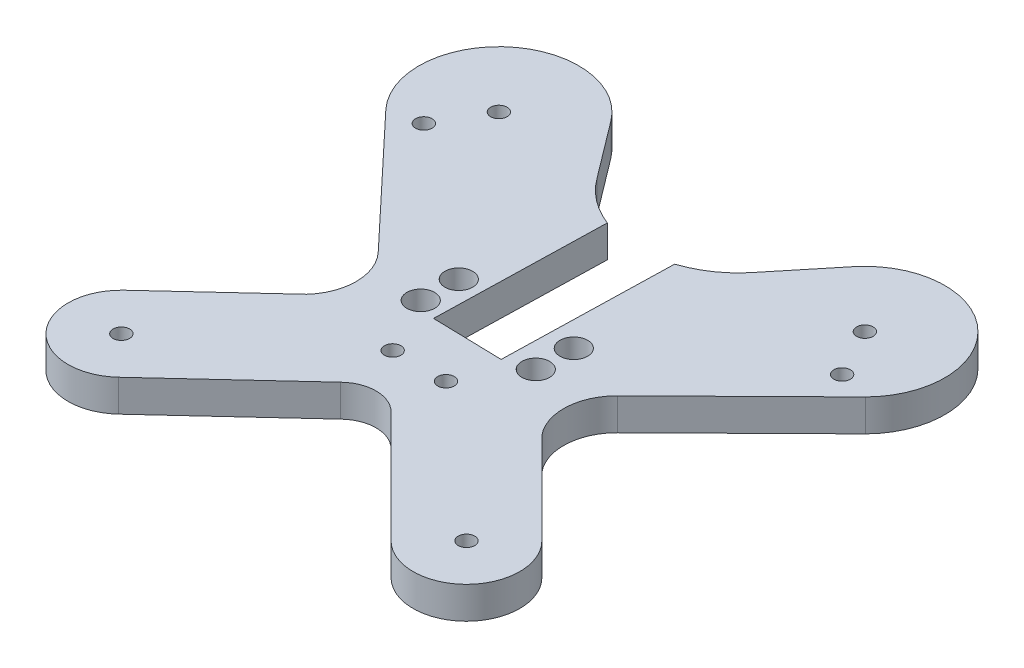
ISO-10303-21;
HEADER;
FILE_DESCRIPTION(('STEP AP214'),'2;1');
FILE_NAME('part.step','',(''),(''),'','','');
FILE_SCHEMA(('AUTOMOTIVE_DESIGN { 1 0 10303 214 1 1 1 1 }'));
ENDSEC;
DATA;
#1=APPLICATION_CONTEXT('core data for automotive mechanical design processes');
#2=APPLICATION_PROTOCOL_DEFINITION('international standard','automotive_design',2000,#1);
#3=PRODUCT_CONTEXT('',#1,'mechanical');
#4=PRODUCT('Part','Part','',(#3));
#5=PRODUCT_RELATED_PRODUCT_CATEGORY('part','',(#4));
#6=PRODUCT_DEFINITION_FORMATION('','',#4);
#7=PRODUCT_DEFINITION_CONTEXT('part definition',#1,'design');
#8=PRODUCT_DEFINITION('design','',#6,#7);
#9=PRODUCT_DEFINITION_SHAPE('','',#8);
#10=(LENGTH_UNIT() NAMED_UNIT(*) SI_UNIT(.MILLI.,.METRE.));
#11=(NAMED_UNIT(*) PLANE_ANGLE_UNIT() SI_UNIT($,.RADIAN.));
#12=(NAMED_UNIT(*) SI_UNIT($,.STERADIAN.) SOLID_ANGLE_UNIT());
#13=UNCERTAINTY_MEASURE_WITH_UNIT(LENGTH_MEASURE(1.E-05),#10,'distance_accuracy_value','');
#14=(GEOMETRIC_REPRESENTATION_CONTEXT(3) GLOBAL_UNCERTAINTY_ASSIGNED_CONTEXT((#13)) GLOBAL_UNIT_ASSIGNED_CONTEXT((#10,
#11,#12)) REPRESENTATION_CONTEXT('',''));
#15=CARTESIAN_POINT('',(0.,0.,0.));
#16=DIRECTION('',(0.,0.,1.));
#17=DIRECTION('',(1.,0.,0.));
#18=AXIS2_PLACEMENT_3D('',#15,#16,#17);
#19=CARTESIAN_POINT('',(145.420498334427,0.,77.6859051133096));
#20=DIRECTION('',(0.,1.,0.));
#21=DIRECTION('',(0.,0.,1.));
#22=AXIS2_PLACEMENT_3D('',#19,#20,#21);
#23=CYLINDRICAL_SURFACE('',#22,15.);
#24=CARTESIAN_POINT('',(145.420498334427,5.99999999999997,77.6859051133096));
#25=DIRECTION('',(0.,1.,0.));
#26=DIRECTION('',(-1.,0.,0.));
#27=AXIS2_PLACEMENT_3D('',#24,#25,#26);
#28=CIRCLE('',#27,15.);
#29=CARTESIAN_POINT('',(156.098066013927,5.99999999999997,88.2210628458594));
#30=VERTEX_POINT('',#29);
#31=CARTESIAN_POINT('',(133.737810721195,5.99999999999997,68.2776741355094));
#32=VERTEX_POINT('',#31);
#33=EDGE_CURVE('E196',#30,#32,#28,.T.);
#34=ORIENTED_EDGE('',*,*,#33,.F.);
#35=DIRECTION('',(0.,1.,0.));
#36=VECTOR('',#35,1.);
#37=CARTESIAN_POINT('',(156.098066013927,0.,88.2210628458594));
#38=LINE('',#37,#36);
#39=CARTESIAN_POINT('',(156.098066013927,0.,88.2210628458594));
#40=VERTEX_POINT('',#39);
#41=EDGE_CURVE('E59',#40,#30,#38,.T.);
#42=ORIENTED_EDGE('',*,*,#41,.F.);
#43=CARTESIAN_POINT('',(145.420498334427,0.,77.6859051133096));
#44=DIRECTION('',(0.,1.,0.));
#45=DIRECTION('',(-1.,0.,0.));
#46=AXIS2_PLACEMENT_3D('',#43,#44,#45);
#47=CIRCLE('',#46,15.);
#48=CARTESIAN_POINT('',(133.737810721195,0.,68.2776741355094));
#49=VERTEX_POINT('',#48);
#50=EDGE_CURVE('E244',#40,#49,#47,.T.);
#51=ORIENTED_EDGE('',*,*,#50,.T.);
#52=DIRECTION('',(0.,1.,0.));
#53=VECTOR('',#52,1.);
#54=CARTESIAN_POINT('',(133.737810721195,0.,68.2776741355094));
#55=LINE('',#54,#53);
#56=EDGE_CURVE('E122',#49,#32,#55,.T.);
#57=ORIENTED_EDGE('',*,*,#56,.T.);
#58=EDGE_LOOP('',(#34,#42,#51,#57));
#59=FACE_BOUND('',#58,.T.);
#60=ADVANCED_FACE('F34',(#59),#23,.T.);
#61=CARTESIAN_POINT('',(156.098066013927,0.,88.2210628458594));
#62=DIRECTION('',(0.701430404943764,0.,0.712737951157666));
#63=DIRECTION('',(0.712737951157666,0.,-0.701430404943764));
#64=AXIS2_PLACEMENT_3D('',#61,#62,#63);
#65=PLANE('',#64);
#66=DIRECTION('',(0.712737951157666,0.,-0.701430404943764));
#67=VECTOR('',#66,1.);
#68=CARTESIAN_POINT('',(156.098066013927,5.99999999999997,88.2210628458594));
#69=LINE('',#68,#67);
#70=CARTESIAN_POINT('',(132.65561135518,5.99999999999997,111.291604322502));
#71=VERTEX_POINT('',#70);
#72=EDGE_CURVE('E241',#71,#30,#69,.T.);
#73=ORIENTED_EDGE('',*,*,#72,.F.);
#74=DIRECTION('',(0.,1.,0.));
#75=VECTOR('',#74,1.);
#76=CARTESIAN_POINT('',(132.65561135518,0.,111.291604322502));
#77=LINE('',#76,#75);
#78=CARTESIAN_POINT('',(132.65561135518,0.,111.291604322502));
#79=VERTEX_POINT('',#78);
#80=EDGE_CURVE('E176',#79,#71,#77,.T.);
#81=ORIENTED_EDGE('',*,*,#80,.F.);
#82=DIRECTION('',(0.712737951157666,0.,-0.701430404943764));
#83=VECTOR('',#82,1.);
#84=CARTESIAN_POINT('',(156.098066013927,0.,88.2210628458594));
#85=LINE('',#84,#83);
#86=EDGE_CURVE('E186',#79,#40,#85,.T.);
#87=ORIENTED_EDGE('',*,*,#86,.T.);
#88=ORIENTED_EDGE('',*,*,#41,.T.);
#89=EDGE_LOOP('',(#73,#81,#87,#88));
#90=FACE_BOUND('',#89,.T.);
#91=ADVANCED_FACE('F470',(#90),#65,.T.);
#92=CARTESIAN_POINT('',(139.669915404618,0.,118.418983834079));
#93=DIRECTION('',(0.,1.,0.));
#94=DIRECTION('',(0.,0.,1.));
#95=AXIS2_PLACEMENT_3D('',#92,#93,#94);
#96=CYLINDRICAL_SURFACE('',#95,10.0000000000005);
#97=CARTESIAN_POINT('',(139.669915404618,5.99999999999997,118.418983834079));
#98=DIRECTION('',(0.,-1.,0.));
#99=DIRECTION('',(-1.,0.,0.));
#100=AXIS2_PLACEMENT_3D('',#97,#98,#99);
#101=CIRCLE('',#100,10.0000000000005);
#102=CARTESIAN_POINT('',(131.98847009833,5.99999999999997,124.82174870611));
#103=VERTEX_POINT('',#102);
#104=EDGE_CURVE('E171',#103,#71,#101,.T.);
#105=ORIENTED_EDGE('',*,*,#104,.F.);
#106=DIRECTION('',(0.,1.,0.));
#107=VECTOR('',#106,1.);
#108=CARTESIAN_POINT('',(131.98847009833,0.,124.82174870611));
#109=LINE('',#108,#107);
#110=CARTESIAN_POINT('',(131.98847009833,0.,124.82174870611));
#111=VERTEX_POINT('',#110);
#112=EDGE_CURVE('E165',#111,#103,#109,.T.);
#113=ORIENTED_EDGE('',*,*,#112,.F.);
#114=CARTESIAN_POINT('',(139.669915404618,0.,118.418983834079));
#115=DIRECTION('',(0.,-1.,0.));
#116=DIRECTION('',(-1.,0.,0.));
#117=AXIS2_PLACEMENT_3D('',#114,#115,#116);
#118=CIRCLE('',#117,10.0000000000005);
#119=EDGE_CURVE('E168',#111,#79,#118,.T.);
#120=ORIENTED_EDGE('',*,*,#119,.T.);
#121=ORIENTED_EDGE('',*,*,#80,.T.);
#122=EDGE_LOOP('',(#105,#113,#120,#121));
#123=FACE_BOUND('',#122,.T.);
#124=ADVANCED_FACE('F167',(#123),#96,.F.);
#125=CARTESIAN_POINT('',(149.107694317768,0.,141.940972925548));
#126=DIRECTION('',(0.707106781186547,0.,-0.707106781186548));
#127=DIRECTION('',(-0.707106781186548,0.,-0.707106781186547));
#128=AXIS2_PLACEMENT_3D('',#125,#126,#127);
#129=PLANE('',#128);
#130=DIRECTION('',(-0.707106781186548,0.,-0.707106781186547));
#131=VECTOR('',#130,1.);
#132=CARTESIAN_POINT('',(149.107694317768,5.99999999999996,141.940972925548));
#133=LINE('',#132,#131);
#134=CARTESIAN_POINT('',(149.107694317768,5.99999999999996,141.940972925548));
#135=VERTEX_POINT('',#134);
#136=EDGE_CURVE('E238',#135,#103,#133,.T.);
#137=ORIENTED_EDGE('',*,*,#136,.F.);
#138=DIRECTION('',(0.,1.,0.));
#139=VECTOR('',#138,1.);
#140=CARTESIAN_POINT('',(149.107694317768,0.,141.940972925548));
#141=LINE('',#140,#139);
#142=CARTESIAN_POINT('',(149.107694317768,0.,141.940972925548));
#143=VERTEX_POINT('',#142);
#144=EDGE_CURVE('E177',#143,#135,#141,.T.);
#145=ORIENTED_EDGE('',*,*,#144,.F.);
#146=DIRECTION('',(-0.707106781186548,0.,-0.707106781186547));
#147=VECTOR('',#146,1.);
#148=CARTESIAN_POINT('',(149.107694317768,0.,141.940972925548));
#149=LINE('',#148,#147);
#150=EDGE_CURVE('E184',#143,#111,#149,.T.);
#151=ORIENTED_EDGE('',*,*,#150,.T.);
#152=ORIENTED_EDGE('',*,*,#112,.T.);
#153=EDGE_LOOP('',(#137,#145,#151,#152));
#154=FACE_BOUND('',#153,.T.);
#155=ADVANCED_FACE('F188',(#154),#129,.T.);
#156=CARTESIAN_POINT('',(142.036626505903,0.,149.012040737414));
#157=DIRECTION('',(0.,1.,0.));
#158=DIRECTION('',(0.,0.,1.));
#159=AXIS2_PLACEMENT_3D('',#156,#157,#158);
#160=CYLINDRICAL_SURFACE('',#159,9.99999999999998);
#161=CARTESIAN_POINT('',(142.036626505903,5.99999999999996,149.012040737414));
#162=DIRECTION('',(0.,1.,0.));
#163=DIRECTION('',(-1.,0.,0.));
#164=AXIS2_PLACEMENT_3D('',#161,#162,#163);
#165=CIRCLE('',#164,9.99999999999998);
#166=CARTESIAN_POINT('',(134.965558694037,5.99999999999996,156.083108549279));
#167=VERTEX_POINT('',#166);
#168=EDGE_CURVE('E235',#167,#135,#165,.T.);
#169=ORIENTED_EDGE('',*,*,#168,.F.);
#170=DIRECTION('',(0.,1.,0.));
#171=VECTOR('',#170,1.);
#172=CARTESIAN_POINT('',(134.965558694037,0.,156.083108549279));
#173=LINE('',#172,#171);
#174=CARTESIAN_POINT('',(134.965558694037,0.,156.083108549279));
#175=VERTEX_POINT('',#174);
#176=EDGE_CURVE('E249',#175,#167,#173,.T.);
#177=ORIENTED_EDGE('',*,*,#176,.F.);
#178=CARTESIAN_POINT('',(142.036626505903,0.,149.012040737414));
#179=DIRECTION('',(0.,1.,0.));
#180=DIRECTION('',(-1.,0.,0.));
#181=AXIS2_PLACEMENT_3D('',#178,#179,#180);
#182=CIRCLE('',#181,9.99999999999998);
#183=EDGE_CURVE('E189',#175,#143,#182,.T.);
#184=ORIENTED_EDGE('',*,*,#183,.T.);
#185=ORIENTED_EDGE('',*,*,#144,.T.);
#186=EDGE_LOOP('',(#169,#177,#184,#185));
#187=FACE_BOUND('',#186,.T.);
#188=ADVANCED_FACE('F483',(#187),#160,.T.);
#189=CARTESIAN_POINT('',(114.107694317768,0.,135.22524417301));
#190=DIRECTION('',(-0.707106781186547,0.,0.707106781186548));
#191=DIRECTION('',(0.707106781186548,0.,0.707106781186547));
#192=AXIS2_PLACEMENT_3D('',#189,#190,#191);
#193=PLANE('',#192);
#194=DIRECTION('',(0.707106781186548,0.,0.707106781186547));
#195=VECTOR('',#194,1.);
#196=CARTESIAN_POINT('',(114.107694317768,5.99999999999997,135.22524417301));
#197=LINE('',#196,#195);
#198=CARTESIAN_POINT('',(114.107694317768,5.99999999999997,135.22524417301));
#199=VERTEX_POINT('',#198);
#200=EDGE_CURVE('E232',#199,#167,#197,.T.);
#201=ORIENTED_EDGE('',*,*,#200,.F.);
#202=DIRECTION('',(0.,1.,0.));
#203=VECTOR('',#202,1.);
#204=CARTESIAN_POINT('',(114.107694317768,0.,135.22524417301));
#205=LINE('',#204,#203);
#206=CARTESIAN_POINT('',(114.107694317768,0.,135.22524417301));
#207=VERTEX_POINT('',#206);
#208=EDGE_CURVE('E251',#207,#199,#205,.T.);
#209=ORIENTED_EDGE('',*,*,#208,.F.);
#210=DIRECTION('',(0.707106781186548,0.,0.707106781186547));
#211=VECTOR('',#210,1.);
#212=CARTESIAN_POINT('',(114.107694317768,0.,135.22524417301));
#213=LINE('',#212,#211);
#214=EDGE_CURVE('E191',#207,#175,#213,.T.);
#215=ORIENTED_EDGE('',*,*,#214,.T.);
#216=ORIENTED_EDGE('',*,*,#176,.T.);
#217=EDGE_LOOP('',(#201,#209,#215,#216));
#218=FACE_BOUND('',#217,.T.);
#219=ADVANCED_FACE('F400',(#218),#193,.T.);
#220=CARTESIAN_POINT('',(109.20638678967,0.,139.940030674159));
#221=DIRECTION('',(0.,1.,0.));
#222=DIRECTION('',(0.,0.,1.));
#223=AXIS2_PLACEMENT_3D('',#220,#221,#222);
#224=CYLINDRICAL_SURFACE('',#223,6.80088429812012);
#225=CARTESIAN_POINT('',(109.20638678967,5.99999999999997,139.940030674159));
#226=DIRECTION('',(0.,-1.,0.));
#227=DIRECTION('',(1.,0.,0.));
#228=AXIS2_PLACEMENT_3D('',#225,#226,#227);
#229=CIRCLE('',#228,6.80088429812012);
#230=CARTESIAN_POINT('',(104.49160028852,5.99999999999997,135.03872314606));
#231=VERTEX_POINT('',#230);
#232=EDGE_CURVE('E229',#231,#199,#229,.T.);
#233=ORIENTED_EDGE('',*,*,#232,.F.);
#234=DIRECTION('',(0.,1.,0.));
#235=VECTOR('',#234,1.);
#236=CARTESIAN_POINT('',(104.49160028852,0.,135.03872314606));
#237=LINE('',#236,#235);
#238=CARTESIAN_POINT('',(104.49160028852,0.,135.03872314606));
#239=VERTEX_POINT('',#238);
#240=EDGE_CURVE('E253',#239,#231,#237,.T.);
#241=ORIENTED_EDGE('',*,*,#240,.F.);
#242=CARTESIAN_POINT('',(109.20638678967,0.,139.940030674159));
#243=DIRECTION('',(0.,-1.,0.));
#244=DIRECTION('',(1.,0.,0.));
#245=AXIS2_PLACEMENT_3D('',#242,#243,#244);
#246=CIRCLE('',#245,6.80088429812012);
#247=EDGE_CURVE('E394',#239,#207,#246,.T.);
#248=ORIENTED_EDGE('',*,*,#247,.T.);
#249=ORIENTED_EDGE('',*,*,#208,.T.);
#250=EDGE_LOOP('',(#233,#241,#248,#249));
#251=FACE_BOUND('',#250,.T.);
#252=ADVANCED_FACE('F406',(#251),#224,.F.);
#253=CARTESIAN_POINT('',(104.49160028852,0.,135.03872314606));
#254=DIRECTION('',(0.679154067520732,0.,0.733995744245186));
#255=DIRECTION('',(0.733995744245187,0.,-0.679154067520732));
#256=AXIS2_PLACEMENT_3D('',#253,#254,#255);
#257=PLANE('',#256);
#258=DIRECTION('',(0.733995744245186,0.,-0.679154067520732));
#259=VECTOR('',#258,1.);
#260=CARTESIAN_POINT('',(104.49160028852,5.99999999999997,135.03872314606));
#261=LINE('',#260,#259);
#262=CARTESIAN_POINT('',(82.8405794051754,5.99999999999997,155.072053058649));
#263=VERTEX_POINT('',#262);
#264=EDGE_CURVE('E226',#263,#231,#261,.T.);
#265=ORIENTED_EDGE('',*,*,#264,.F.);
#266=DIRECTION('',(0.,1.,0.));
#267=VECTOR('',#266,1.);
#268=CARTESIAN_POINT('',(82.8405794051754,0.,155.072053058649));
#269=LINE('',#268,#267);
#270=CARTESIAN_POINT('',(82.8405794051754,0.,155.072053058649));
#271=VERTEX_POINT('',#270);
#272=EDGE_CURVE('E255',#271,#263,#269,.T.);
#273=ORIENTED_EDGE('',*,*,#272,.F.);
#274=DIRECTION('',(0.733995744245186,0.,-0.679154067520732));
#275=VECTOR('',#274,1.);
#276=CARTESIAN_POINT('',(104.49160028852,0.,135.03872314606));
#277=LINE('',#276,#275);
#278=EDGE_CURVE('E391',#271,#239,#277,.T.);
#279=ORIENTED_EDGE('',*,*,#278,.T.);
#280=ORIENTED_EDGE('',*,*,#240,.T.);
#281=EDGE_LOOP('',(#265,#273,#279,#280));
#282=FACE_BOUND('',#281,.T.);
#283=ADVANCED_FACE('F409',(#282),#257,.T.);
#284=CARTESIAN_POINT('',(76.0490387299681,0.,147.732095616197));
#285=DIRECTION('',(0.,1.,0.));
#286=DIRECTION('',(0.,0.,1.));
#287=AXIS2_PLACEMENT_3D('',#284,#285,#286);
#288=CYLINDRICAL_SURFACE('',#287,10.);
#289=CARTESIAN_POINT('',(76.0490387299681,5.99999999999997,147.732095616197));
#290=DIRECTION('',(0.,1.,0.));
#291=DIRECTION('',(1.,0.,0.));
#292=AXIS2_PLACEMENT_3D('',#289,#290,#291);
#293=CIRCLE('',#292,10.);
#294=CARTESIAN_POINT('',(69.2574980547608,5.99999999999997,140.392138173746));
#295=VERTEX_POINT('',#294);
#296=EDGE_CURVE('E223',#295,#263,#293,.T.);
#297=ORIENTED_EDGE('',*,*,#296,.F.);
#298=DIRECTION('',(0.,1.,0.));
#299=VECTOR('',#298,1.);
#300=CARTESIAN_POINT('',(69.2574980547608,0.,140.392138173746));
#301=LINE('',#300,#299);
#302=CARTESIAN_POINT('',(69.2574980547608,0.,140.392138173746));
#303=VERTEX_POINT('',#302);
#304=EDGE_CURVE('E257',#303,#295,#301,.T.);
#305=ORIENTED_EDGE('',*,*,#304,.F.);
#306=CARTESIAN_POINT('',(76.0490387299681,0.,147.732095616197));
#307=DIRECTION('',(0.,1.,0.));
#308=DIRECTION('',(1.,0.,0.));
#309=AXIS2_PLACEMENT_3D('',#306,#307,#308);
#310=CIRCLE('',#309,10.);
#311=EDGE_CURVE('E388',#303,#271,#310,.T.);
#312=ORIENTED_EDGE('',*,*,#311,.T.);
#313=ORIENTED_EDGE('',*,*,#272,.T.);
#314=EDGE_LOOP('',(#297,#305,#312,#313));
#315=FACE_BOUND('',#314,.T.);
#316=ADVANCED_FACE('F414',(#315),#288,.T.);
#317=CARTESIAN_POINT('',(69.2574980547608,0.,140.392138173746));
#318=DIRECTION('',(-0.679154067520732,0.,-0.733995744245187));
#319=DIRECTION('',(-0.733995744245187,0.,0.679154067520732));
#320=AXIS2_PLACEMENT_3D('',#317,#318,#319);
#321=PLANE('',#320);
#322=DIRECTION('',(-0.733995744245187,0.,0.679154067520732));
#323=VECTOR('',#322,1.);
#324=CARTESIAN_POINT('',(69.2574980547608,5.99999999999997,140.392138173746));
#325=LINE('',#324,#323);
#326=CARTESIAN_POINT('',(87.027710498151,5.99999999999997,123.949655834768));
#327=VERTEX_POINT('',#326);
#328=EDGE_CURVE('E220',#327,#295,#325,.T.);
#329=ORIENTED_EDGE('',*,*,#328,.F.);
#330=DIRECTION('',(0.,1.,0.));
#331=VECTOR('',#330,1.);
#332=CARTESIAN_POINT('',(87.027710498151,0.,123.949655834768));
#333=LINE('',#332,#331);
#334=CARTESIAN_POINT('',(87.027710498151,0.,123.949655834768));
#335=VERTEX_POINT('',#334);
#336=EDGE_CURVE('E259',#335,#327,#333,.T.);
#337=ORIENTED_EDGE('',*,*,#336,.F.);
#338=DIRECTION('',(-0.733995744245187,0.,0.679154067520732));
#339=VECTOR('',#338,1.);
#340=CARTESIAN_POINT('',(69.2574980547608,0.,140.392138173746));
#341=LINE('',#340,#339);
#342=EDGE_CURVE('E385',#335,#303,#341,.T.);
#343=ORIENTED_EDGE('',*,*,#342,.T.);
#344=ORIENTED_EDGE('',*,*,#304,.T.);
#345=EDGE_LOOP('',(#329,#337,#343,#344));
#346=FACE_BOUND('',#345,.T.);
#347=ADVANCED_FACE('F417',(#346),#321,.T.);
#348=CARTESIAN_POINT('',(79.6003353782354,0.,117.253828863582));
#349=DIRECTION('',(0.,1.,0.));
#350=DIRECTION('',(0.,0.,1.));
#351=AXIS2_PLACEMENT_3D('',#348,#349,#350);
#352=CYLINDRICAL_SURFACE('',#351,10.0000000000005);
#353=CARTESIAN_POINT('',(79.6003353782354,5.99999999999997,117.253828863582));
#354=DIRECTION('',(0.,-1.,0.));
#355=DIRECTION('',(1.,0.,0.));
#356=AXIS2_PLACEMENT_3D('',#353,#354,#355);
#357=CIRCLE('',#356,10.0000000000005);
#358=CARTESIAN_POINT('',(86.8857554621085,5.99999999999997,110.403817608006));
#359=VERTEX_POINT('',#358);
#360=EDGE_CURVE('E217',#359,#327,#357,.T.);
#361=ORIENTED_EDGE('',*,*,#360,.F.);
#362=DIRECTION('',(0.,1.,0.));
#363=VECTOR('',#362,1.);
#364=CARTESIAN_POINT('',(86.8857554621085,0.,110.403817608006));
#365=LINE('',#364,#363);
#366=CARTESIAN_POINT('',(86.8857554621085,0.,110.403817608006));
#367=VERTEX_POINT('',#366);
#368=EDGE_CURVE('E261',#367,#359,#365,.T.);
#369=ORIENTED_EDGE('',*,*,#368,.F.);
#370=CARTESIAN_POINT('',(79.6003353782354,0.,117.253828863582));
#371=DIRECTION('',(0.,-1.,0.));
#372=DIRECTION('',(1.,0.,0.));
#373=AXIS2_PLACEMENT_3D('',#370,#371,#372);
#374=CIRCLE('',#373,10.0000000000005);
#375=EDGE_CURVE('E382',#367,#335,#374,.T.);
#376=ORIENTED_EDGE('',*,*,#375,.T.);
#377=ORIENTED_EDGE('',*,*,#336,.T.);
#378=EDGE_LOOP('',(#361,#369,#376,#377));
#379=FACE_BOUND('',#378,.T.);
#380=ADVANCED_FACE('F422',(#379),#352,.F.);
#381=CARTESIAN_POINT('',(64.3555845893641,0.,86.4415563437221));
#382=DIRECTION('',(-0.72854200838727,0.,0.685001125557501));
#383=DIRECTION('',(0.685001125557501,0.,0.72854200838727));
#384=AXIS2_PLACEMENT_3D('',#381,#382,#383);
#385=PLANE('',#384);
#386=DIRECTION('',(0.6850011255575,0.,0.72854200838727));
#387=VECTOR('',#386,1.);
#388=CARTESIAN_POINT('',(64.3555845893641,5.99999999999998,86.4415563437221));
#389=LINE('',#388,#387);
#390=CARTESIAN_POINT('',(64.3555845893641,5.99999999999998,86.4415563437221));
#391=VERTEX_POINT('',#390);
#392=EDGE_CURVE('E214',#391,#359,#389,.T.);
#393=ORIENTED_EDGE('',*,*,#392,.F.);
#394=DIRECTION('',(0.,1.,0.));
#395=VECTOR('',#394,1.);
#396=CARTESIAN_POINT('',(64.3555845893641,0.,86.4415563437221));
#397=LINE('',#396,#395);
#398=CARTESIAN_POINT('',(64.3555845893641,0.,86.4415563437221));
#399=VERTEX_POINT('',#398);
#400=EDGE_CURVE('E263',#399,#391,#397,.T.);
#401=ORIENTED_EDGE('',*,*,#400,.F.);
#402=DIRECTION('',(0.6850011255575,0.,0.72854200838727));
#403=VECTOR('',#402,1.);
#404=CARTESIAN_POINT('',(64.3555845893641,0.,86.4415563437221));
#405=LINE('',#404,#403);
#406=EDGE_CURVE('E379',#399,#367,#405,.T.);
#407=ORIENTED_EDGE('',*,*,#406,.T.);
#408=ORIENTED_EDGE('',*,*,#368,.T.);
#409=EDGE_LOOP('',(#393,#401,#407,#408));
#410=FACE_BOUND('',#409,.T.);
#411=ADVANCED_FACE('F425',(#410),#385,.T.);
#412=CARTESIAN_POINT('',(75.4336628144966,0.,76.3283875605046));
#413=DIRECTION('',(0.,1.,0.));
#414=DIRECTION('',(0.,0.,1.));
#415=AXIS2_PLACEMENT_3D('',#412,#413,#414);
#416=CYLINDRICAL_SURFACE('',#415,15.);
#417=CARTESIAN_POINT('',(75.4336628144966,5.99999999999998,76.3283875605046));
#418=DIRECTION('',(0.,1.,0.));
#419=DIRECTION('',(1.,0.,0.));
#420=AXIS2_PLACEMENT_3D('',#417,#418,#419);
#421=CIRCLE('',#420,15.);
#422=CARTESIAN_POINT('',(87.4724039327921,5.99999999999998,67.3802753413457));
#423=VERTEX_POINT('',#422);
#424=EDGE_CURVE('E211',#423,#391,#421,.T.);
#425=ORIENTED_EDGE('',*,*,#424,.F.);
#426=DIRECTION('',(0.,1.,0.));
#427=VECTOR('',#426,1.);
#428=CARTESIAN_POINT('',(87.4724039327921,0.,67.3802753413457));
#429=LINE('',#428,#427);
#430=CARTESIAN_POINT('',(87.4724039327921,0.,67.3802753413457));
#431=VERTEX_POINT('',#430);
#432=EDGE_CURVE('E265',#431,#423,#429,.T.);
#433=ORIENTED_EDGE('',*,*,#432,.F.);
#434=CARTESIAN_POINT('',(75.4336628144966,0.,76.3283875605046));
#435=DIRECTION('',(0.,1.,0.));
#436=DIRECTION('',(1.,0.,0.));
#437=AXIS2_PLACEMENT_3D('',#434,#435,#436);
#438=CIRCLE('',#437,15.);
#439=EDGE_CURVE('E376',#431,#399,#438,.T.);
#440=ORIENTED_EDGE('',*,*,#439,.T.);
#441=ORIENTED_EDGE('',*,*,#400,.T.);
#442=EDGE_LOOP('',(#425,#433,#440,#441));
#443=FACE_BOUND('',#442,.T.);
#444=ADVANCED_FACE('F430',(#443),#416,.T.);
#445=CARTESIAN_POINT('',(95.2822169290583,0.,77.7313532051608));
#446=DIRECTION('',(0.798275218365471,0.,-0.602292848823195));
#447=DIRECTION('',(-0.602292848823195,0.,-0.798275218365471));
#448=AXIS2_PLACEMENT_3D('',#445,#446,#447);
#449=PLANE('',#448);
#450=DIRECTION('',(-0.602292848823195,0.,-0.798275218365471));
#451=VECTOR('',#450,1.);
#452=CARTESIAN_POINT('',(95.2822169290583,5.99999999999998,77.7313532051608));
#453=LINE('',#452,#451);
#454=CARTESIAN_POINT('',(95.2822169290583,5.99999999999998,77.7313532051608));
#455=VERTEX_POINT('',#454);
#456=EDGE_CURVE('E208',#455,#423,#453,.T.);
#457=ORIENTED_EDGE('',*,*,#456,.F.);
#458=DIRECTION('',(0.,1.,0.));
#459=VECTOR('',#458,1.);
#460=CARTESIAN_POINT('',(95.2822169290583,0.,77.7313532051608));
#461=LINE('',#460,#459);
#462=CARTESIAN_POINT('',(95.2822169290583,0.,77.7313532051608));
#463=VERTEX_POINT('',#462);
#464=EDGE_CURVE('E267',#463,#455,#461,.T.);
#465=ORIENTED_EDGE('',*,*,#464,.F.);
#466=DIRECTION('',(-0.602292848823195,0.,-0.798275218365471));
#467=VECTOR('',#466,1.);
#468=CARTESIAN_POINT('',(95.2822169290583,0.,77.7313532051608));
#469=LINE('',#468,#467);
#470=EDGE_CURVE('E373',#463,#431,#469,.T.);
#471=ORIENTED_EDGE('',*,*,#470,.T.);
#472=ORIENTED_EDGE('',*,*,#432,.T.);
#473=EDGE_LOOP('',(#457,#465,#471,#472));
#474=FACE_BOUND('',#473,.T.);
#475=ADVANCED_FACE('F433',(#474),#449,.T.);
#476=CARTESIAN_POINT('',(110.328842906012,0.,66.9046547575992));
#477=DIRECTION('',(0.,1.,0.));
#478=DIRECTION('',(0.,0.,1.));
#479=AXIS2_PLACEMENT_3D('',#476,#477,#478);
#480=CYLINDRICAL_SURFACE('',#479,18.5369456104498);
#481=DIRECTION('',(0.,-1.,0.));
#482=VECTOR('',#481,1.);
#483=CARTESIAN_POINT('',(103.61834975049,9.99999999999998,84.1843432436358));
#484=LINE('',#483,#482);
#485=CARTESIAN_POINT('',(103.61834975049,5.99999999999998,84.1843432436358));
#486=VERTEX_POINT('',#485);
#487=CARTESIAN_POINT('',(103.61834975049,0.,84.1843432436358));
#488=VERTEX_POINT('',#487);
#489=EDGE_CURVE('E50',#486,#488,#484,.T.);
#490=ORIENTED_EDGE('',*,*,#489,.T.);
#491=CARTESIAN_POINT('',(110.328842906012,0.,66.9046547575992));
#492=DIRECTION('',(0.,-1.,0.));
#493=DIRECTION('',(1.,0.,0.));
#494=AXIS2_PLACEMENT_3D('',#491,#492,#493);
#495=CIRCLE('',#494,18.5369456104498);
#496=EDGE_CURVE('E371',#488,#463,#495,.T.);
#497=ORIENTED_EDGE('',*,*,#496,.T.);
#498=ORIENTED_EDGE('',*,*,#464,.T.);
#499=CARTESIAN_POINT('',(110.328842906012,5.99999999999998,66.9046547575992));
#500=DIRECTION('',(0.,-1.,0.));
#501=DIRECTION('',(1.,0.,0.));
#502=AXIS2_PLACEMENT_3D('',#499,#500,#501);
#503=CIRCLE('',#502,18.5369456104498);
#504=EDGE_CURVE('E206',#486,#455,#503,.T.);
#505=ORIENTED_EDGE('',*,*,#504,.F.);
#506=EDGE_LOOP('',(#490,#497,#498,#505));
#507=FACE_BOUND('',#506,.T.);
#508=ADVANCED_FACE('F442',(#507),#480,.F.);
#509=CARTESIAN_POINT('',(110.917008077929,0.,66.916063253767));
#510=DIRECTION('',(0.,1.,0.));
#511=DIRECTION('',(0.,0.,1.));
#512=AXIS2_PLACEMENT_3D('',#509,#510,#511);
#513=CYLINDRICAL_SURFACE('',#512,18.5369456104498);
#514=DIRECTION('',(0.,-1.,0.));
#515=VECTOR('',#514,1.);
#516=CARTESIAN_POINT('',(116.6227068222,9.99999999999998,84.5530515001879));
#517=LINE('',#516,#515);
#518=CARTESIAN_POINT('',(116.6227068222,5.99999999999998,84.5530515001879));
#519=VERTEX_POINT('',#518);
#520=CARTESIAN_POINT('',(116.6227068222,0.,84.5530515001879));
#521=VERTEX_POINT('',#520);
#522=EDGE_CURVE('E309',#519,#521,#517,.T.);
#523=ORIENTED_EDGE('',*,*,#522,.F.);
#524=CARTESIAN_POINT('',(110.917008077929,5.99999999999998,66.916063253767));
#525=DIRECTION('',(0.,-1.,0.));
#526=DIRECTION('',(-1.,0.,0.));
#527=AXIS2_PLACEMENT_3D('',#524,#525,#526);
#528=CIRCLE('',#527,18.5369456104498);
#529=CARTESIAN_POINT('',(125.532468515252,5.99999999999997,78.3181099459099));
#530=VERTEX_POINT('',#529);
#531=EDGE_CURVE('E203',#530,#519,#528,.T.);
#532=ORIENTED_EDGE('',*,*,#531,.F.);
#533=DIRECTION('',(0.,1.,0.));
#534=VECTOR('',#533,1.);
#535=CARTESIAN_POINT('',(125.532468515252,0.,78.3181099459099));
#536=LINE('',#535,#534);
#537=CARTESIAN_POINT('',(125.532468515252,0.,78.3181099459099));
#538=VERTEX_POINT('',#537);
#539=EDGE_CURVE('E270',#538,#530,#536,.T.);
#540=ORIENTED_EDGE('',*,*,#539,.F.);
#541=CARTESIAN_POINT('',(110.917008077929,0.,66.916063253767));
#542=DIRECTION('',(0.,-1.,0.));
#543=DIRECTION('',(-1.,0.,0.));
#544=AXIS2_PLACEMENT_3D('',#541,#542,#543);
#545=CIRCLE('',#544,18.5369456104498);
#546=EDGE_CURVE('E368',#538,#521,#545,.T.);
#547=ORIENTED_EDGE('',*,*,#546,.T.);
#548=EDGE_LOOP('',(#523,#532,#540,#547));
#549=FACE_BOUND('',#548,.T.);
#550=ADVANCED_FACE('F468',(#549),#513,.F.);
#551=CARTESIAN_POINT('',(125.532468515252,0.,78.3181099459099));
#552=DIRECTION('',(-0.77431850039991,0.,-0.632796065046579));
#553=DIRECTION('',(-0.632796065046579,0.,0.77431850039991));
#554=AXIS2_PLACEMENT_3D('',#551,#552,#553);
#555=PLANE('',#554);
#556=DIRECTION('',(-0.632796065046579,0.,0.77431850039991));
#557=VECTOR('',#556,1.);
#558=CARTESIAN_POINT('',(125.532468515252,5.99999999999997,78.3181099459099));
#559=LINE('',#558,#557);
#560=EDGE_CURVE('E199',#32,#530,#559,.T.);
#561=ORIENTED_EDGE('',*,*,#560,.F.);
#562=ORIENTED_EDGE('',*,*,#56,.F.);
#563=DIRECTION('',(-0.632796065046579,0.,0.77431850039991));
#564=VECTOR('',#563,1.);
#565=CARTESIAN_POINT('',(125.532468515252,0.,78.3181099459099));
#566=LINE('',#565,#564);
#567=EDGE_CURVE('E366',#49,#538,#566,.T.);
#568=ORIENTED_EDGE('',*,*,#567,.T.);
#569=ORIENTED_EDGE('',*,*,#539,.T.);
#570=EDGE_LOOP('',(#561,#562,#568,#569));
#571=FACE_BOUND('',#570,.T.);
#572=ADVANCED_FACE('F469',(#571),#555,.T.);
#573=CARTESIAN_POINT('',(145.420498334427,0.,77.6859051133096));
#574=DIRECTION('',(0.,1.,0.));
#575=DIRECTION('',(-1.,0.,0.));
#576=AXIS2_PLACEMENT_3D('',#573,#574,#575);
#577=PLANE('',#576);
#578=CARTESIAN_POINT('',(114.20638678967,0.,125.017952482024));
#579=DIRECTION('',(0.,-1.,0.));
#580=DIRECTION('',(1.,0.,0.));
#581=AXIS2_PLACEMENT_3D('',#578,#579,#580);
#582=CIRCLE('',#581,1.54999999999999);
#583=CARTESIAN_POINT('',(115.75638678967,0.,125.017952482024));
#584=VERTEX_POINT('',#583);
#585=EDGE_CURVE('E298',#584,#584,#582,.T.);
#586=ORIENTED_EDGE('',*,*,#585,.F.);
#587=EDGE_LOOP('',(#586));
#588=FACE_BOUND('',#587,.T.);
#589=CARTESIAN_POINT('',(104.20638678967,0.,125.017952482024));
#590=DIRECTION('',(0.,-1.,0.));
#591=DIRECTION('',(1.,0.,0.));
#592=AXIS2_PLACEMENT_3D('',#589,#590,#591);
#593=CIRCLE('',#592,1.54999999999999);
#594=CARTESIAN_POINT('',(105.75638678967,0.,125.017952482024));
#595=VERTEX_POINT('',#594);
#596=EDGE_CURVE('E287',#595,#595,#593,.T.);
#597=ORIENTED_EDGE('',*,*,#596,.F.);
#598=EDGE_LOOP('',(#597));
#599=FACE_BOUND('',#598,.T.);
#600=CARTESIAN_POINT('',(150.24502004355,0.,86.7811780759343));
#601=DIRECTION('',(0.,-1.,0.));
#602=DIRECTION('',(0.,0.,-1.));
#603=AXIS2_PLACEMENT_3D('',#600,#601,#602);
#604=CIRCLE('',#603,1.55000000069923);
#605=CARTESIAN_POINT('',(150.24502004355,0.,85.2311780752351));
#606=VERTEX_POINT('',#605);
#607=EDGE_CURVE('E281',#606,#606,#604,.T.);
#608=ORIENTED_EDGE('',*,*,#607,.F.);
#609=EDGE_LOOP('',(#608));
#610=FACE_BOUND('',#609,.T.);
#611=CARTESIAN_POINT('',(70.2600651636294,0.,85.2297294441574));
#612=DIRECTION('',(0.,-1.,0.));
#613=DIRECTION('',(0.,0.,-1.));
#614=AXIS2_PLACEMENT_3D('',#611,#612,#613);
#615=CIRCLE('',#614,1.55000000069884);
#616=CARTESIAN_POINT('',(70.2600651636294,0.,83.6797294434586));
#617=VERTEX_POINT('',#616);
#618=EDGE_CURVE('E277',#617,#617,#615,.T.);
#619=ORIENTED_EDGE('',*,*,#618,.F.);
#620=EDGE_LOOP('',(#619));
#621=FACE_BOUND('',#620,.T.);
#622=CARTESIAN_POINT('',(120.698510015395,0.,114.67528334295));
#623=DIRECTION('',(0.,-1.,0.));
#624=DIRECTION('',(1.,0.,0.));
#625=AXIS2_PLACEMENT_3D('',#622,#623,#624);
#626=CIRCLE('',#625,2.60000000017017);
#627=CARTESIAN_POINT('',(123.298510015565,0.,114.67528334295));
#628=VERTEX_POINT('',#627);
#629=EDGE_CURVE('E276',#628,#628,#626,.T.);
#630=ORIENTED_EDGE('',*,*,#629,.F.);
#631=EDGE_LOOP('',(#630));
#632=FACE_BOUND('',#631,.T.);
#633=CARTESIAN_POINT('',(120.834261770675,0.,107.676599790956));
#634=DIRECTION('',(0.,-1.,0.));
#635=DIRECTION('',(1.,0.,0.));
#636=AXIS2_PLACEMENT_3D('',#633,#634,#635);
#637=CIRCLE('',#636,2.60000000017011);
#638=CARTESIAN_POINT('',(123.434261770845,0.,107.676599790956));
#639=VERTEX_POINT('',#638);
#640=EDGE_CURVE('E322',#639,#639,#637,.T.);
#641=ORIENTED_EDGE('',*,*,#640,.F.);
#642=EDGE_LOOP('',(#641));
#643=FACE_BOUND('',#642,.T.);
#644=CARTESIAN_POINT('',(98.7026474233032,0.,114.248634969464));
#645=DIRECTION('',(0.,-1.,0.));
#646=DIRECTION('',(1.,0.,0.));
#647=AXIS2_PLACEMENT_3D('',#644,#645,#646);
#648=CIRCLE('',#647,2.6);
#649=CARTESIAN_POINT('',(101.302647423303,0.,114.248634969464));
#650=VERTEX_POINT('',#649);
#651=EDGE_CURVE('E328',#650,#650,#648,.T.);
#652=ORIENTED_EDGE('',*,*,#651,.F.);
#653=EDGE_LOOP('',(#652));
#654=FACE_BOUND('',#653,.T.);
#655=CARTESIAN_POINT('',(98.8383991786969,0.,107.249951417218));
#656=DIRECTION('',(0.,-1.,0.));
#657=DIRECTION('',(1.,0.,0.));
#658=AXIS2_PLACEMENT_3D('',#655,#656,#657);
#659=CIRCLE('',#658,2.60000000017004);
#660=CARTESIAN_POINT('',(101.438399178867,0.,107.249951417218));
#661=VERTEX_POINT('',#660);
#662=EDGE_CURVE('E334',#661,#661,#659,.T.);
#663=ORIENTED_EDGE('',*,*,#662,.F.);
#664=EDGE_LOOP('',(#663));
#665=FACE_BOUND('',#664,.T.);
#666=CARTESIAN_POINT('',(145.420498334427,0.,77.6859051133096));
#667=DIRECTION('',(0.,1.,0.));
#668=DIRECTION('',(-1.,0.,0.));
#669=AXIS2_PLACEMENT_3D('',#666,#667,#668);
#670=CIRCLE('',#669,1.55000000000002);
#671=CARTESIAN_POINT('',(143.870498334427,0.,77.6859051133096));
#672=VERTEX_POINT('',#671);
#673=EDGE_CURVE('E343',#672,#672,#670,.T.);
#674=ORIENTED_EDGE('',*,*,#673,.T.);
#675=EDGE_LOOP('',(#674));
#676=FACE_BOUND('',#675,.T.);
#677=CARTESIAN_POINT('',(142.036626505903,0.,149.012040737414));
#678=DIRECTION('',(0.,1.,0.));
#679=DIRECTION('',(-1.,0.,0.));
#680=AXIS2_PLACEMENT_3D('',#677,#678,#679);
#681=CIRCLE('',#680,1.54999999999999);
#682=CARTESIAN_POINT('',(140.486626505903,0.,149.012040737414));
#683=VERTEX_POINT('',#682);
#684=EDGE_CURVE('E349',#683,#683,#681,.T.);
#685=ORIENTED_EDGE('',*,*,#684,.T.);
#686=EDGE_LOOP('',(#685));
#687=FACE_BOUND('',#686,.T.);
#688=CARTESIAN_POINT('',(76.0490387299681,0.,147.732095616197));
#689=DIRECTION('',(0.,1.,0.));
#690=DIRECTION('',(1.,0.,0.));
#691=AXIS2_PLACEMENT_3D('',#688,#689,#690);
#692=CIRCLE('',#691,1.55000000000001);
#693=CARTESIAN_POINT('',(77.5990387299682,0.,147.732095616197));
#694=VERTEX_POINT('',#693);
#695=EDGE_CURVE('E355',#694,#694,#692,.T.);
#696=ORIENTED_EDGE('',*,*,#695,.T.);
#697=EDGE_LOOP('',(#696));
#698=FACE_BOUND('',#697,.T.);
#699=CARTESIAN_POINT('',(75.4336628144966,0.,76.3283875605046));
#700=DIRECTION('',(0.,1.,0.));
#701=DIRECTION('',(1.,0.,0.));
#702=AXIS2_PLACEMENT_3D('',#699,#700,#701);
#703=CIRCLE('',#702,1.54999999999999);
#704=CARTESIAN_POINT('',(76.9836628144966,0.,76.3283875605046));
#705=VERTEX_POINT('',#704);
#706=EDGE_CURVE('E200',#705,#705,#703,.T.);
#707=ORIENTED_EDGE('',*,*,#706,.T.);
#708=EDGE_LOOP('',(#707));
#709=FACE_BOUND('',#708,.T.);
#710=DIRECTION('',(-0.999692187914613,0.,-0.0248098654267662));
#711=VECTOR('',#710,1.);
#712=CARTESIAN_POINT('',(115.830023537137,0.,116.30365097818));
#713=LINE('',#712,#711);
#714=CARTESIAN_POINT('',(115.830023537137,0.,116.30365097818));
#715=VERTEX_POINT('',#714);
#716=CARTESIAN_POINT('',(102.834025094247,0.,115.981122727632));
#717=VERTEX_POINT('',#716);
#718=EDGE_CURVE('E286',#715,#717,#713,.T.);
#719=ORIENTED_EDGE('',*,*,#718,.F.);
#720=DIRECTION('',(-0.0249581543237565,0.,0.999688496749238));
#721=VECTOR('',#720,1.);
#722=CARTESIAN_POINT('',(116.6227068222,0.,84.5530515001879));
#723=LINE('',#722,#721);
#724=EDGE_CURVE('E302',#521,#715,#723,.T.);
#725=ORIENTED_EDGE('',*,*,#724,.F.);
#726=ORIENTED_EDGE('',*,*,#546,.F.);
#727=ORIENTED_EDGE('',*,*,#567,.F.);
#728=ORIENTED_EDGE('',*,*,#50,.F.);
#729=ORIENTED_EDGE('',*,*,#86,.F.);
#730=ORIENTED_EDGE('',*,*,#119,.F.);
#731=ORIENTED_EDGE('',*,*,#150,.F.);
#732=ORIENTED_EDGE('',*,*,#183,.F.);
#733=ORIENTED_EDGE('',*,*,#214,.F.);
#734=ORIENTED_EDGE('',*,*,#247,.F.);
#735=ORIENTED_EDGE('',*,*,#278,.F.);
#736=ORIENTED_EDGE('',*,*,#311,.F.);
#737=ORIENTED_EDGE('',*,*,#342,.F.);
#738=ORIENTED_EDGE('',*,*,#375,.F.);
#739=ORIENTED_EDGE('',*,*,#406,.F.);
#740=ORIENTED_EDGE('',*,*,#439,.F.);
#741=ORIENTED_EDGE('',*,*,#470,.F.);
#742=ORIENTED_EDGE('',*,*,#496,.F.);
#743=DIRECTION('',(0.0246592946304064,0.,-0.999695913359823));
#744=VECTOR('',#743,1.);
#745=CARTESIAN_POINT('',(102.834025094247,0.,115.981122727632));
#746=LINE('',#745,#744);
#747=EDGE_CURVE('E291',#717,#488,#746,.T.);
#748=ORIENTED_EDGE('',*,*,#747,.F.);
#749=EDGE_LOOP('',(#719,#725,#726,#727,#728,#729,#730,#731,#732,#733,#734,#735,#736,#737,#738,
#739,#740,#741,#742,#748));
#750=FACE_BOUND('',#749,.T.);
#751=ADVANCED_FACE('F182',(#588,#599,#610,#621,#632,#643,#654,#665,#676,#687,#698,#709,#750),
#577,.F.);
#752=CARTESIAN_POINT('',(145.420498334427,5.99999999999997,77.6859051133096));
#753=DIRECTION('',(0.,1.,0.));
#754=DIRECTION('',(-1.,0.,0.));
#755=AXIS2_PLACEMENT_3D('',#752,#753,#754);
#756=PLANE('',#755);
#757=CARTESIAN_POINT('',(114.20638678967,5.99999999999997,125.017952482024));
#758=DIRECTION('',(0.,1.,0.));
#759=DIRECTION('',(-1.,0.,0.));
#760=AXIS2_PLACEMENT_3D('',#757,#758,#759);
#761=CIRCLE('',#760,1.54999999999999);
#762=CARTESIAN_POINT('',(112.65638678967,5.99999999999997,125.017952482024));
#763=VERTEX_POINT('',#762);
#764=EDGE_CURVE('E37',#763,#763,#761,.T.);
#765=ORIENTED_EDGE('',*,*,#764,.F.);
#766=EDGE_LOOP('',(#765));
#767=FACE_BOUND('',#766,.T.);
#768=CARTESIAN_POINT('',(104.20638678967,5.99999999999997,125.017952482024));
#769=DIRECTION('',(0.,1.,0.));
#770=DIRECTION('',(-1.,0.,0.));
#771=AXIS2_PLACEMENT_3D('',#768,#769,#770);
#772=CIRCLE('',#771,1.54999999999999);
#773=CARTESIAN_POINT('',(102.65638678967,5.99999999999997,125.017952482024));
#774=VERTEX_POINT('',#773);
#775=EDGE_CURVE('E284',#774,#774,#772,.T.);
#776=ORIENTED_EDGE('',*,*,#775,.F.);
#777=EDGE_LOOP('',(#776));
#778=FACE_BOUND('',#777,.T.);
#779=DIRECTION('',(0.0249581543237565,0.,-0.999688496749238));
#780=VECTOR('',#779,1.);
#781=CARTESIAN_POINT('',(116.81198314951,5.99999999999998,76.9716668888221));
#782=LINE('',#781,#780);
#783=CARTESIAN_POINT('',(115.830023537137,5.99999999999997,116.30365097818));
#784=VERTEX_POINT('',#783);
#785=EDGE_CURVE('E11',#784,#519,#782,.T.);
#786=ORIENTED_EDGE('',*,*,#785,.F.);
#787=DIRECTION('',(0.999692187914613,0.,0.0248098654267662));
#788=VECTOR('',#787,1.);
#789=CARTESIAN_POINT('',(144.444478363662,5.99999999999997,117.013790341165));
#790=LINE('',#789,#788);
#791=CARTESIAN_POINT('',(102.834025094247,5.99999999999997,115.981122727632));
#792=VERTEX_POINT('',#791);
#793=EDGE_CURVE('E42',#792,#784,#790,.T.);
#794=ORIENTED_EDGE('',*,*,#793,.F.);
#795=DIRECTION('',(-0.0246592946304064,0.,0.999695913359823));
#796=VECTOR('',#795,1.);
#797=CARTESIAN_POINT('',(103.803967006482,5.99999999999998,76.6593586467322));
#798=LINE('',#797,#796);
#799=EDGE_CURVE('E246',#486,#792,#798,.T.);
#800=ORIENTED_EDGE('',*,*,#799,.F.);
#801=ORIENTED_EDGE('',*,*,#504,.T.);
#802=ORIENTED_EDGE('',*,*,#456,.T.);
#803=ORIENTED_EDGE('',*,*,#424,.T.);
#804=ORIENTED_EDGE('',*,*,#392,.T.);
#805=ORIENTED_EDGE('',*,*,#360,.T.);
#806=ORIENTED_EDGE('',*,*,#328,.T.);
#807=ORIENTED_EDGE('',*,*,#296,.T.);
#808=ORIENTED_EDGE('',*,*,#264,.T.);
#809=ORIENTED_EDGE('',*,*,#232,.T.);
#810=ORIENTED_EDGE('',*,*,#200,.T.);
#811=ORIENTED_EDGE('',*,*,#168,.T.);
#812=ORIENTED_EDGE('',*,*,#136,.T.);
#813=ORIENTED_EDGE('',*,*,#104,.T.);
#814=ORIENTED_EDGE('',*,*,#72,.T.);
#815=ORIENTED_EDGE('',*,*,#33,.T.);
#816=ORIENTED_EDGE('',*,*,#560,.T.);
#817=ORIENTED_EDGE('',*,*,#531,.T.);
#818=EDGE_LOOP('',(#786,#794,#800,#801,#802,#803,#804,#805,#806,#807,#808,#809,#810,#811,#812,
#813,#814,#815,#816,#817));
#819=FACE_BOUND('',#818,.T.);
#820=CARTESIAN_POINT('',(150.24502004355,5.99999999999997,86.7811780759343));
#821=DIRECTION('',(0.,1.,0.));
#822=DIRECTION('',(-1.,0.,0.));
#823=AXIS2_PLACEMENT_3D('',#820,#821,#822);
#824=CIRCLE('',#823,1.55000000069923);
#825=CARTESIAN_POINT('',(148.695020042851,5.99999999999997,86.7811780759343));
#826=VERTEX_POINT('',#825);
#827=EDGE_CURVE('E278',#826,#826,#824,.T.);
#828=ORIENTED_EDGE('',*,*,#827,.F.);
#829=EDGE_LOOP('',(#828));
#830=FACE_BOUND('',#829,.T.);
#831=CARTESIAN_POINT('',(70.2600651636294,5.99999999999998,85.2297294441574));
#832=DIRECTION('',(0.,1.,0.));
#833=DIRECTION('',(-1.,0.,0.));
#834=AXIS2_PLACEMENT_3D('',#831,#832,#833);
#835=CIRCLE('',#834,1.55000000069884);
#836=CARTESIAN_POINT('',(68.7100651629306,5.99999999999998,85.2297294441574));
#837=VERTEX_POINT('',#836);
#838=EDGE_CURVE('E273',#837,#837,#835,.T.);
#839=ORIENTED_EDGE('',*,*,#838,.F.);
#840=EDGE_LOOP('',(#839));
#841=FACE_BOUND('',#840,.T.);
#842=CARTESIAN_POINT('',(120.698510015395,5.99999999999999,114.67528334295));
#843=DIRECTION('',(0.,-1.,0.));
#844=DIRECTION('',(1.,0.,0.));
#845=AXIS2_PLACEMENT_3D('',#842,#843,#844);
#846=CIRCLE('',#845,2.60000000017017);
#847=CARTESIAN_POINT('',(123.298510015565,5.99999999999999,114.67528334295));
#848=VERTEX_POINT('',#847);
#849=EDGE_CURVE('E319',#848,#848,#846,.T.);
#850=ORIENTED_EDGE('',*,*,#849,.T.);
#851=EDGE_LOOP('',(#850));
#852=FACE_BOUND('',#851,.T.);
#853=CARTESIAN_POINT('',(120.834261770675,5.99999999999999,107.676599790956));
#854=DIRECTION('',(0.,-1.,0.));
#855=DIRECTION('',(1.,0.,0.));
#856=AXIS2_PLACEMENT_3D('',#853,#854,#855);
#857=CIRCLE('',#856,2.60000000017011);
#858=CARTESIAN_POINT('',(123.434261770845,5.99999999999999,107.676599790956));
#859=VERTEX_POINT('',#858);
#860=EDGE_CURVE('E325',#859,#859,#857,.T.);
#861=ORIENTED_EDGE('',*,*,#860,.T.);
#862=EDGE_LOOP('',(#861));
#863=FACE_BOUND('',#862,.T.);
#864=CARTESIAN_POINT('',(98.7026474233032,5.99999999999999,114.248634969464));
#865=DIRECTION('',(0.,-1.,0.));
#866=DIRECTION('',(1.,0.,0.));
#867=AXIS2_PLACEMENT_3D('',#864,#865,#866);
#868=CIRCLE('',#867,2.6);
#869=CARTESIAN_POINT('',(101.302647423303,5.99999999999999,114.248634969464));
#870=VERTEX_POINT('',#869);
#871=EDGE_CURVE('E331',#870,#870,#868,.T.);
#872=ORIENTED_EDGE('',*,*,#871,.T.);
#873=EDGE_LOOP('',(#872));
#874=FACE_BOUND('',#873,.T.);
#875=CARTESIAN_POINT('',(98.8383991786969,5.99999999999999,107.249951417218));
#876=DIRECTION('',(0.,-1.,0.));
#877=DIRECTION('',(1.,0.,0.));
#878=AXIS2_PLACEMENT_3D('',#875,#876,#877);
#879=CIRCLE('',#878,2.60000000017004);
#880=CARTESIAN_POINT('',(101.438399178867,5.99999999999999,107.249951417218));
#881=VERTEX_POINT('',#880);
#882=EDGE_CURVE('E337',#881,#881,#879,.T.);
#883=ORIENTED_EDGE('',*,*,#882,.T.);
#884=EDGE_LOOP('',(#883));
#885=FACE_BOUND('',#884,.T.);
#886=CARTESIAN_POINT('',(145.420498334427,5.99999999999997,77.6859051133096));
#887=DIRECTION('',(0.,1.,0.));
#888=DIRECTION('',(-1.,0.,0.));
#889=AXIS2_PLACEMENT_3D('',#886,#887,#888);
#890=CIRCLE('',#889,1.55000000000002);
#891=CARTESIAN_POINT('',(143.870498334427,5.99999999999997,77.6859051133096));
#892=VERTEX_POINT('',#891);
#893=EDGE_CURVE('E340',#892,#892,#890,.T.);
#894=ORIENTED_EDGE('',*,*,#893,.F.);
#895=EDGE_LOOP('',(#894));
#896=FACE_BOUND('',#895,.T.);
#897=CARTESIAN_POINT('',(142.036626505903,5.99999999999996,149.012040737414));
#898=DIRECTION('',(0.,1.,0.));
#899=DIRECTION('',(-1.,0.,0.));
#900=AXIS2_PLACEMENT_3D('',#897,#898,#899);
#901=CIRCLE('',#900,1.54999999999999);
#902=CARTESIAN_POINT('',(140.486626505903,5.99999999999996,149.012040737414));
#903=VERTEX_POINT('',#902);
#904=EDGE_CURVE('E346',#903,#903,#901,.T.);
#905=ORIENTED_EDGE('',*,*,#904,.F.);
#906=EDGE_LOOP('',(#905));
#907=FACE_BOUND('',#906,.T.);
#908=CARTESIAN_POINT('',(76.0490387299681,5.99999999999997,147.732095616197));
#909=DIRECTION('',(0.,1.,0.));
#910=DIRECTION('',(1.,0.,0.));
#911=AXIS2_PLACEMENT_3D('',#908,#909,#910);
#912=CIRCLE('',#911,1.55000000000001);
#913=CARTESIAN_POINT('',(77.5990387299682,5.99999999999997,147.732095616197));
#914=VERTEX_POINT('',#913);
#915=EDGE_CURVE('E352',#914,#914,#912,.T.);
#916=ORIENTED_EDGE('',*,*,#915,.F.);
#917=EDGE_LOOP('',(#916));
#918=FACE_BOUND('',#917,.T.);
#919=CARTESIAN_POINT('',(75.4336628144966,5.99999999999998,76.3283875605046));
#920=DIRECTION('',(0.,1.,0.));
#921=DIRECTION('',(1.,0.,0.));
#922=AXIS2_PLACEMENT_3D('',#919,#920,#921);
#923=CIRCLE('',#922,1.54999999999999);
#924=CARTESIAN_POINT('',(76.9836628144966,5.99999999999998,76.3283875605046));
#925=VERTEX_POINT('',#924);
#926=EDGE_CURVE('E358',#925,#925,#923,.T.);
#927=ORIENTED_EDGE('',*,*,#926,.F.);
#928=EDGE_LOOP('',(#927));
#929=FACE_BOUND('',#928,.T.);
#930=ADVANCED_FACE('F446',(#767,#778,#819,#830,#841,#852,#863,#874,#885,#896,#907,#918,#929),
#756,.T.);
#931=CARTESIAN_POINT('',(75.4336628144966,0.,76.3283875605046));
#932=DIRECTION('',(0.,1.,0.));
#933=DIRECTION('',(0.,0.,1.));
#934=AXIS2_PLACEMENT_3D('',#931,#932,#933);
#935=CYLINDRICAL_SURFACE('',#934,1.54999999999999);
#936=ORIENTED_EDGE('',*,*,#706,.F.);
#937=EDGE_LOOP('',(#936));
#938=FACE_BOUND('',#937,.T.);
#939=ORIENTED_EDGE('',*,*,#926,.T.);
#940=EDGE_LOOP('',(#939));
#941=FACE_BOUND('',#940,.T.);
#942=ADVANCED_FACE('F516',(#938,#941),#935,.F.);
#943=CARTESIAN_POINT('',(76.0490387299681,0.,147.732095616197));
#944=DIRECTION('',(0.,1.,0.));
#945=DIRECTION('',(0.,0.,1.));
#946=AXIS2_PLACEMENT_3D('',#943,#944,#945);
#947=CYLINDRICAL_SURFACE('',#946,1.55000000000001);
#948=ORIENTED_EDGE('',*,*,#695,.F.);
#949=EDGE_LOOP('',(#948));
#950=FACE_BOUND('',#949,.T.);
#951=ORIENTED_EDGE('',*,*,#915,.T.);
#952=EDGE_LOOP('',(#951));
#953=FACE_BOUND('',#952,.T.);
#954=ADVANCED_FACE('F523',(#950,#953),#947,.F.);
#955=CARTESIAN_POINT('',(142.036626505903,0.,149.012040737414));
#956=DIRECTION('',(0.,1.,0.));
#957=DIRECTION('',(0.,0.,1.));
#958=AXIS2_PLACEMENT_3D('',#955,#956,#957);
#959=CYLINDRICAL_SURFACE('',#958,1.54999999999999);
#960=ORIENTED_EDGE('',*,*,#684,.F.);
#961=EDGE_LOOP('',(#960));
#962=FACE_BOUND('',#961,.T.);
#963=ORIENTED_EDGE('',*,*,#904,.T.);
#964=EDGE_LOOP('',(#963));
#965=FACE_BOUND('',#964,.T.);
#966=ADVANCED_FACE('F527',(#962,#965),#959,.F.);
#967=CARTESIAN_POINT('',(145.420498334427,0.,77.6859051133096));
#968=DIRECTION('',(0.,1.,0.));
#969=DIRECTION('',(0.,0.,1.));
#970=AXIS2_PLACEMENT_3D('',#967,#968,#969);
#971=CYLINDRICAL_SURFACE('',#970,1.55000000000002);
#972=ORIENTED_EDGE('',*,*,#673,.F.);
#973=EDGE_LOOP('',(#972));
#974=FACE_BOUND('',#973,.T.);
#975=ORIENTED_EDGE('',*,*,#893,.T.);
#976=EDGE_LOOP('',(#975));
#977=FACE_BOUND('',#976,.T.);
#978=ADVANCED_FACE('F531',(#974,#977),#971,.F.);
#979=CARTESIAN_POINT('',(98.8383991786969,5.99999999999999,107.249951417218));
#980=DIRECTION('',(0.,-1.,0.));
#981=DIRECTION('',(1.,0.,0.));
#982=AXIS2_PLACEMENT_3D('',#979,#980,#981);
#983=CYLINDRICAL_SURFACE('',#982,2.60000000017004);
#984=ORIENTED_EDGE('',*,*,#882,.F.);
#985=EDGE_LOOP('',(#984));
#986=FACE_BOUND('',#985,.T.);
#987=ORIENTED_EDGE('',*,*,#662,.T.);
#988=EDGE_LOOP('',(#987));
#989=FACE_BOUND('',#988,.T.);
#990=ADVANCED_FACE('F535',(#986,#989),#983,.F.);
#991=CARTESIAN_POINT('',(98.7026474233032,5.99999999999999,114.248634969464));
#992=DIRECTION('',(0.,-1.,0.));
#993=DIRECTION('',(1.,0.,0.));
#994=AXIS2_PLACEMENT_3D('',#991,#992,#993);
#995=CYLINDRICAL_SURFACE('',#994,2.6);
#996=ORIENTED_EDGE('',*,*,#871,.F.);
#997=EDGE_LOOP('',(#996));
#998=FACE_BOUND('',#997,.T.);
#999=ORIENTED_EDGE('',*,*,#651,.T.);
#1000=EDGE_LOOP('',(#999));
#1001=FACE_BOUND('',#1000,.T.);
#1002=ADVANCED_FACE('F539',(#998,#1001),#995,.F.);
#1003=CARTESIAN_POINT('',(120.834261770675,5.99999999999999,107.676599790956));
#1004=DIRECTION('',(0.,-1.,0.));
#1005=DIRECTION('',(1.,0.,0.));
#1006=AXIS2_PLACEMENT_3D('',#1003,#1004,#1005);
#1007=CYLINDRICAL_SURFACE('',#1006,2.60000000017011);
#1008=ORIENTED_EDGE('',*,*,#860,.F.);
#1009=EDGE_LOOP('',(#1008));
#1010=FACE_BOUND('',#1009,.T.);
#1011=ORIENTED_EDGE('',*,*,#640,.T.);
#1012=EDGE_LOOP('',(#1011));
#1013=FACE_BOUND('',#1012,.T.);
#1014=ADVANCED_FACE('F543',(#1010,#1013),#1007,.F.);
#1015=CARTESIAN_POINT('',(120.698510015395,5.99999999999999,114.67528334295));
#1016=DIRECTION('',(0.,-1.,0.));
#1017=DIRECTION('',(1.,0.,0.));
#1018=AXIS2_PLACEMENT_3D('',#1015,#1016,#1017);
#1019=CYLINDRICAL_SURFACE('',#1018,2.60000000017017);
#1020=ORIENTED_EDGE('',*,*,#849,.F.);
#1021=EDGE_LOOP('',(#1020));
#1022=FACE_BOUND('',#1021,.T.);
#1023=ORIENTED_EDGE('',*,*,#629,.T.);
#1024=EDGE_LOOP('',(#1023));
#1025=FACE_BOUND('',#1024,.T.);
#1026=ADVANCED_FACE('F547',(#1022,#1025),#1019,.F.);
#1027=CARTESIAN_POINT('',(70.2600651636294,9.99999999999998,85.2297294441574));
#1028=DIRECTION('',(0.,-1.,0.));
#1029=DIRECTION('',(0.,0.,-1.));
#1030=AXIS2_PLACEMENT_3D('',#1027,#1028,#1029);
#1031=CYLINDRICAL_SURFACE('',#1030,1.55000000069884);
#1032=ORIENTED_EDGE('',*,*,#838,.T.);
#1033=EDGE_LOOP('',(#1032));
#1034=FACE_BOUND('',#1033,.T.);
#1035=ORIENTED_EDGE('',*,*,#618,.T.);
#1036=EDGE_LOOP('',(#1035));
#1037=FACE_BOUND('',#1036,.T.);
#1038=ADVANCED_FACE('F551',(#1034,#1037),#1031,.F.);
#1039=CARTESIAN_POINT('',(150.24502004355,9.99999999999997,86.7811780759343));
#1040=DIRECTION('',(0.,-1.,0.));
#1041=DIRECTION('',(0.,0.,-1.));
#1042=AXIS2_PLACEMENT_3D('',#1039,#1040,#1041);
#1043=CYLINDRICAL_SURFACE('',#1042,1.55000000069923);
#1044=ORIENTED_EDGE('',*,*,#827,.T.);
#1045=EDGE_LOOP('',(#1044));
#1046=FACE_BOUND('',#1045,.T.);
#1047=ORIENTED_EDGE('',*,*,#607,.T.);
#1048=EDGE_LOOP('',(#1047));
#1049=FACE_BOUND('',#1048,.T.);
#1050=ADVANCED_FACE('F555',(#1046,#1049),#1043,.F.);
#1051=CARTESIAN_POINT('',(115.830023537137,9.99999999999997,116.30365097818));
#1052=DIRECTION('',(-0.0248098654267662,0.,0.999692187914613));
#1053=DIRECTION('',(0.999692187914613,0.,0.0248098654267662));
#1054=AXIS2_PLACEMENT_3D('',#1051,#1052,#1053);
#1055=PLANE('',#1054);
#1056=ORIENTED_EDGE('',*,*,#793,.T.);
#1057=DIRECTION('',(0.,-1.,0.));
#1058=VECTOR('',#1057,1.);
#1059=CARTESIAN_POINT('',(115.830023537137,9.99999999999997,116.30365097818));
#1060=LINE('',#1059,#1058);
#1061=EDGE_CURVE('E306',#784,#715,#1060,.T.);
#1062=ORIENTED_EDGE('',*,*,#1061,.T.);
#1063=ORIENTED_EDGE('',*,*,#718,.T.);
#1064=DIRECTION('',(0.,-1.,0.));
#1065=VECTOR('',#1064,1.);
#1066=CARTESIAN_POINT('',(102.834025094247,9.99999999999998,115.981122727632));
#1067=LINE('',#1066,#1065);
#1068=EDGE_CURVE('E305',#792,#717,#1067,.T.);
#1069=ORIENTED_EDGE('',*,*,#1068,.F.);
#1070=EDGE_LOOP('',(#1056,#1062,#1063,#1069));
#1071=FACE_BOUND('',#1070,.T.);
#1072=ADVANCED_FACE('F456',(#1071),#1055,.F.);
#1073=CARTESIAN_POINT('',(116.6227068222,9.99999999999998,84.5530515001879));
#1074=DIRECTION('',(0.999688496749238,0.,0.0249581543237565));
#1075=DIRECTION('',(0.0249581543237565,0.,-0.999688496749238));
#1076=AXIS2_PLACEMENT_3D('',#1073,#1074,#1075);
#1077=PLANE('',#1076);
#1078=ORIENTED_EDGE('',*,*,#785,.T.);
#1079=ORIENTED_EDGE('',*,*,#522,.T.);
#1080=ORIENTED_EDGE('',*,*,#724,.T.);
#1081=ORIENTED_EDGE('',*,*,#1061,.F.);
#1082=EDGE_LOOP('',(#1078,#1079,#1080,#1081));
#1083=FACE_BOUND('',#1082,.T.);
#1084=ADVANCED_FACE('F465',(#1083),#1077,.F.);
#1085=CARTESIAN_POINT('',(102.834025094247,9.99999999999998,115.981122727632));
#1086=DIRECTION('',(-0.999695913359823,0.,-0.0246592946304064));
#1087=DIRECTION('',(-0.0246592946304064,0.,0.999695913359823));
#1088=AXIS2_PLACEMENT_3D('',#1085,#1086,#1087);
#1089=PLANE('',#1088);
#1090=ORIENTED_EDGE('',*,*,#799,.T.);
#1091=ORIENTED_EDGE('',*,*,#1068,.T.);
#1092=ORIENTED_EDGE('',*,*,#747,.T.);
#1093=ORIENTED_EDGE('',*,*,#489,.F.);
#1094=EDGE_LOOP('',(#1090,#1091,#1092,#1093));
#1095=FACE_BOUND('',#1094,.T.);
#1096=ADVANCED_FACE('F451',(#1095),#1089,.F.);
#1097=CARTESIAN_POINT('',(104.20638678967,9.99999999999997,125.017952482024));
#1098=DIRECTION('',(0.,-1.,0.));
#1099=DIRECTION('',(1.,0.,0.));
#1100=AXIS2_PLACEMENT_3D('',#1097,#1098,#1099);
#1101=CYLINDRICAL_SURFACE('',#1100,1.54999999999999);
#1102=ORIENTED_EDGE('',*,*,#775,.T.);
#1103=EDGE_LOOP('',(#1102));
#1104=FACE_BOUND('',#1103,.T.);
#1105=ORIENTED_EDGE('',*,*,#596,.T.);
#1106=EDGE_LOOP('',(#1105));
#1107=FACE_BOUND('',#1106,.T.);
#1108=ADVANCED_FACE('F564',(#1104,#1107),#1101,.F.);
#1109=CARTESIAN_POINT('',(114.20638678967,9.99999999999997,125.017952482024));
#1110=DIRECTION('',(0.,-1.,0.));
#1111=DIRECTION('',(1.,0.,0.));
#1112=AXIS2_PLACEMENT_3D('',#1109,#1110,#1111);
#1113=CYLINDRICAL_SURFACE('',#1112,1.54999999999999);
#1114=ORIENTED_EDGE('',*,*,#764,.T.);
#1115=EDGE_LOOP('',(#1114));
#1116=FACE_BOUND('',#1115,.T.);
#1117=ORIENTED_EDGE('',*,*,#585,.T.);
#1118=EDGE_LOOP('',(#1117));
#1119=FACE_BOUND('',#1118,.T.);
#1120=ADVANCED_FACE('F569',(#1116,#1119),#1113,.F.);
#1121=CLOSED_SHELL('',(#60,#91,#124,#155,#188,#219,#252,#283,#316,#347,#380,#411,#444,#475,#508,
#550,#572,#751,#930,#942,#954,#966,#978,#990,#1002,#1014,#1026,#1038,#1050,#1072,#1084,#1096,
#1108,#1120));
#1122=MANIFOLD_SOLID_BREP('B2',#1121);
#1123=ADVANCED_BREP_SHAPE_REPRESENTATION('',(#18,#1122),#14);
#1124=SHAPE_DEFINITION_REPRESENTATION(#9,#1123);
ENDSEC;
END-ISO-10303-21;
